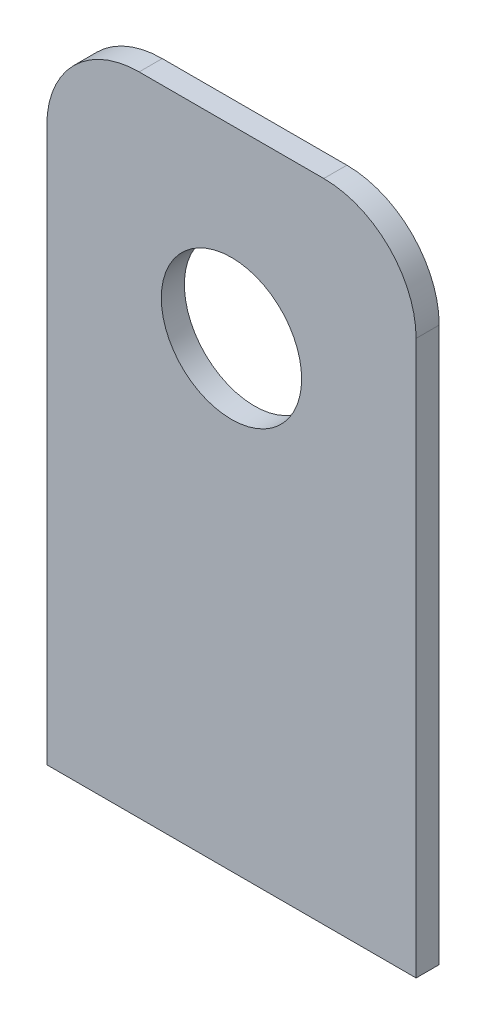
ISO-10303-21;
HEADER;
FILE_DESCRIPTION(('STEP AP214'),'2;1');
FILE_NAME('part.step','',(''),(''),'','','');
FILE_SCHEMA(('AUTOMOTIVE_DESIGN { 1 0 10303 214 1 1 1 1 }'));
ENDSEC;
DATA;
#1=APPLICATION_CONTEXT('core data for automotive mechanical design processes');
#2=APPLICATION_PROTOCOL_DEFINITION('international standard','automotive_design',2000,#1);
#3=PRODUCT_CONTEXT('',#1,'mechanical');
#4=PRODUCT('Part','Part','',(#3));
#5=PRODUCT_RELATED_PRODUCT_CATEGORY('part','',(#4));
#6=PRODUCT_DEFINITION_FORMATION('','',#4);
#7=PRODUCT_DEFINITION_CONTEXT('part definition',#1,'design');
#8=PRODUCT_DEFINITION('design','',#6,#7);
#9=PRODUCT_DEFINITION_SHAPE('','',#8);
#10=(LENGTH_UNIT() NAMED_UNIT(*) SI_UNIT(.MILLI.,.METRE.));
#11=(NAMED_UNIT(*) PLANE_ANGLE_UNIT() SI_UNIT($,.RADIAN.));
#12=(NAMED_UNIT(*) SI_UNIT($,.STERADIAN.) SOLID_ANGLE_UNIT());
#13=UNCERTAINTY_MEASURE_WITH_UNIT(LENGTH_MEASURE(1.E-05),#10,'distance_accuracy_value','');
#14=(GEOMETRIC_REPRESENTATION_CONTEXT(3) GLOBAL_UNCERTAINTY_ASSIGNED_CONTEXT((#13)) GLOBAL_UNIT_ASSIGNED_CONTEXT((#10,
#11,#12)) REPRESENTATION_CONTEXT('',''));
#15=CARTESIAN_POINT('',(0.,0.,0.));
#16=DIRECTION('',(0.,0.,1.));
#17=DIRECTION('',(1.,0.,0.));
#18=AXIS2_PLACEMENT_3D('',#15,#16,#17);
#19=CARTESIAN_POINT('',(-12.7,0.,1.5875));
#20=DIRECTION('',(1.,0.,0.));
#21=DIRECTION('',(0.,0.,-1.));
#22=AXIS2_PLACEMENT_3D('',#19,#20,#21);
#23=PLANE('',#22);
#24=DIRECTION('',(0.,-1.,0.));
#25=VECTOR('',#24,1.);
#26=CARTESIAN_POINT('',(-12.7,0.,1.5875));
#27=LINE('',#26,#25);
#28=CARTESIAN_POINT('',(-12.7,25.4,1.5875));
#29=VERTEX_POINT('',#28);
#30=CARTESIAN_POINT('',(-12.7,-12.7,1.58750000000001));
#31=VERTEX_POINT('',#30);
#32=EDGE_CURVE('E127',#29,#31,#27,.T.);
#33=ORIENTED_EDGE('',*,*,#32,.F.);
#34=DIRECTION('',(0.,0.,-1.));
#35=VECTOR('',#34,1.);
#36=CARTESIAN_POINT('',(-12.7,25.4,1.5875));
#37=LINE('',#36,#35);
#38=CARTESIAN_POINT('',(-12.7,25.4,0.));
#39=VERTEX_POINT('',#38);
#40=EDGE_CURVE('E11',#29,#39,#37,.T.);
#41=ORIENTED_EDGE('',*,*,#40,.T.);
#42=DIRECTION('',(0.,-1.,0.));
#43=VECTOR('',#42,1.);
#44=CARTESIAN_POINT('',(-12.7,0.,0.));
#45=LINE('',#44,#43);
#46=CARTESIAN_POINT('',(-12.7,-12.7,0.));
#47=VERTEX_POINT('',#46);
#48=EDGE_CURVE('E102',#39,#47,#45,.T.);
#49=ORIENTED_EDGE('',*,*,#48,.T.);
#50=DIRECTION('',(0.,0.,-1.));
#51=VECTOR('',#50,1.);
#52=CARTESIAN_POINT('',(-12.7,-12.7,29.9855633142473));
#53=LINE('',#52,#51);
#54=EDGE_CURVE('E111',#31,#47,#53,.T.);
#55=ORIENTED_EDGE('',*,*,#54,.F.);
#56=EDGE_LOOP('',(#33,#41,#49,#55));
#57=FACE_BOUND('',#56,.T.);
#58=ADVANCED_FACE('F39',(#57),#23,.F.);
#59=CARTESIAN_POINT('',(12.7,0.,1.5875));
#60=DIRECTION('',(-1.,0.,0.));
#61=DIRECTION('',(0.,0.,1.));
#62=AXIS2_PLACEMENT_3D('',#59,#60,#61);
#63=PLANE('',#62);
#64=DIRECTION('',(0.,1.,0.));
#65=VECTOR('',#64,1.);
#66=CARTESIAN_POINT('',(12.7,0.,0.));
#67=LINE('',#66,#65);
#68=CARTESIAN_POINT('',(12.7,-12.7,0.));
#69=VERTEX_POINT('',#68);
#70=CARTESIAN_POINT('',(12.7,25.4,0.));
#71=VERTEX_POINT('',#70);
#72=EDGE_CURVE('E93',#69,#71,#67,.T.);
#73=ORIENTED_EDGE('',*,*,#72,.T.);
#74=DIRECTION('',(0.,0.,-1.));
#75=VECTOR('',#74,1.);
#76=CARTESIAN_POINT('',(12.7,25.4,1.5875));
#77=LINE('',#76,#75);
#78=CARTESIAN_POINT('',(12.7,25.4,1.5875));
#79=VERTEX_POINT('',#78);
#80=EDGE_CURVE('E62',#71,#79,#77,.F.);
#81=ORIENTED_EDGE('',*,*,#80,.T.);
#82=DIRECTION('',(0.,1.,0.));
#83=VECTOR('',#82,1.);
#84=CARTESIAN_POINT('',(12.7,0.,1.5875));
#85=LINE('',#84,#83);
#86=CARTESIAN_POINT('',(12.7,-12.7,1.5875));
#87=VERTEX_POINT('',#86);
#88=EDGE_CURVE('E107',#87,#79,#85,.T.);
#89=ORIENTED_EDGE('',*,*,#88,.F.);
#90=DIRECTION('',(0.,0.,-1.));
#91=VECTOR('',#90,1.);
#92=CARTESIAN_POINT('',(12.7,-12.7,29.9855633142473));
#93=LINE('',#92,#91);
#94=EDGE_CURVE('E105',#87,#69,#93,.T.);
#95=ORIENTED_EDGE('',*,*,#94,.T.);
#96=EDGE_LOOP('',(#73,#81,#89,#95));
#97=FACE_BOUND('',#96,.T.);
#98=ADVANCED_FACE('F106',(#97),#63,.F.);
#99=CARTESIAN_POINT('',(-12.7,31.75,1.5875));
#100=DIRECTION('',(0.,-1.,0.));
#101=DIRECTION('',(0.,0.,-1.));
#102=AXIS2_PLACEMENT_3D('',#99,#100,#101);
#103=PLANE('',#102);
#104=DIRECTION('',(-1.,0.,0.));
#105=VECTOR('',#104,1.);
#106=CARTESIAN_POINT('',(-12.7,31.75,1.5875));
#107=LINE('',#106,#105);
#108=CARTESIAN_POINT('',(6.35,31.75,1.5875));
#109=VERTEX_POINT('',#108);
#110=CARTESIAN_POINT('',(-6.35,31.75,1.5875));
#111=VERTEX_POINT('',#110);
#112=EDGE_CURVE('E130',#109,#111,#107,.T.);
#113=ORIENTED_EDGE('',*,*,#112,.F.);
#114=DIRECTION('',(0.,0.,-1.));
#115=VECTOR('',#114,1.);
#116=CARTESIAN_POINT('',(6.35,31.75,1.5875));
#117=LINE('',#116,#115);
#118=CARTESIAN_POINT('',(6.35,31.75,0.));
#119=VERTEX_POINT('',#118);
#120=EDGE_CURVE('E137',#109,#119,#117,.T.);
#121=ORIENTED_EDGE('',*,*,#120,.T.);
#122=DIRECTION('',(-1.,0.,0.));
#123=VECTOR('',#122,1.);
#124=CARTESIAN_POINT('',(-12.7,31.75,0.));
#125=LINE('',#124,#123);
#126=CARTESIAN_POINT('',(-6.35,31.75,0.));
#127=VERTEX_POINT('',#126);
#128=EDGE_CURVE('E101',#119,#127,#125,.T.);
#129=ORIENTED_EDGE('',*,*,#128,.T.);
#130=DIRECTION('',(0.,0.,-1.));
#131=VECTOR('',#130,1.);
#132=CARTESIAN_POINT('',(-6.35,31.75,1.5875));
#133=LINE('',#132,#131);
#134=EDGE_CURVE('E132',#127,#111,#133,.F.);
#135=ORIENTED_EDGE('',*,*,#134,.T.);
#136=EDGE_LOOP('',(#113,#121,#129,#135));
#137=FACE_BOUND('',#136,.T.);
#138=ADVANCED_FACE('F150',(#137),#103,.F.);
#139=CARTESIAN_POINT('',(0.,0.,1.5875));
#140=DIRECTION('',(0.,0.,-1.));
#141=DIRECTION('',(-1.,0.,0.));
#142=AXIS2_PLACEMENT_3D('',#139,#140,#141);
#143=PLANE('',#142);
#144=CARTESIAN_POINT('',(0.,19.05,1.5875));
#145=DIRECTION('',(0.,0.,-1.));
#146=DIRECTION('',(-1.,0.,0.));
#147=AXIS2_PLACEMENT_3D('',#144,#145,#146);
#148=CIRCLE('',#147,4.826);
#149=CARTESIAN_POINT('',(-4.826,19.05,1.5875));
#150=VERTEX_POINT('',#149);
#151=EDGE_CURVE('E124',#150,#150,#148,.T.);
#152=ORIENTED_EDGE('',*,*,#151,.T.);
#153=EDGE_LOOP('',(#152));
#154=FACE_BOUND('',#153,.T.);
#155=ORIENTED_EDGE('',*,*,#88,.T.);
#156=CARTESIAN_POINT('',(6.35,25.4,1.5875));
#157=DIRECTION('',(0.,0.,-1.));
#158=DIRECTION('',(-1.,0.,0.));
#159=AXIS2_PLACEMENT_3D('',#156,#157,#158);
#160=CIRCLE('',#159,6.35);
#161=EDGE_CURVE('E47',#79,#109,#160,.F.);
#162=ORIENTED_EDGE('',*,*,#161,.T.);
#163=ORIENTED_EDGE('',*,*,#112,.T.);
#164=CARTESIAN_POINT('',(-6.35,25.4,1.5875));
#165=DIRECTION('',(0.,0.,-1.));
#166=DIRECTION('',(-1.,0.,0.));
#167=AXIS2_PLACEMENT_3D('',#164,#165,#166);
#168=CIRCLE('',#167,6.35);
#169=EDGE_CURVE('E54',#111,#29,#168,.F.);
#170=ORIENTED_EDGE('',*,*,#169,.T.);
#171=ORIENTED_EDGE('',*,*,#32,.T.);
#172=DIRECTION('',(1.,0.,0.));
#173=VECTOR('',#172,1.);
#174=CARTESIAN_POINT('',(12.7,-12.7,1.5875));
#175=LINE('',#174,#173);
#176=EDGE_CURVE('E118',#31,#87,#175,.T.);
#177=ORIENTED_EDGE('',*,*,#176,.T.);
#178=EDGE_LOOP('',(#155,#162,#163,#170,#171,#177));
#179=FACE_BOUND('',#178,.T.);
#180=ADVANCED_FACE('F146',(#154,#179),#143,.F.);
#181=CARTESIAN_POINT('',(0.,0.,0.));
#182=DIRECTION('',(0.,0.,-1.));
#183=DIRECTION('',(-1.,0.,0.));
#184=AXIS2_PLACEMENT_3D('',#181,#182,#183);
#185=PLANE('',#184);
#186=CARTESIAN_POINT('',(0.,19.05,0.));
#187=DIRECTION('',(0.,0.,1.));
#188=DIRECTION('',(1.,0.,0.));
#189=AXIS2_PLACEMENT_3D('',#186,#187,#188);
#190=CIRCLE('',#189,4.826);
#191=CARTESIAN_POINT('',(4.826,19.05,0.));
#192=VERTEX_POINT('',#191);
#193=EDGE_CURVE('E121',#192,#192,#190,.T.);
#194=ORIENTED_EDGE('',*,*,#193,.T.);
#195=EDGE_LOOP('',(#194));
#196=FACE_BOUND('',#195,.T.);
#197=ORIENTED_EDGE('',*,*,#128,.F.);
#198=CARTESIAN_POINT('',(6.35,25.4,0.));
#199=DIRECTION('',(0.,0.,-1.));
#200=DIRECTION('',(-1.,0.,0.));
#201=AXIS2_PLACEMENT_3D('',#198,#199,#200);
#202=CIRCLE('',#201,6.35);
#203=EDGE_CURVE('E100',#119,#71,#202,.T.);
#204=ORIENTED_EDGE('',*,*,#203,.T.);
#205=ORIENTED_EDGE('',*,*,#72,.F.);
#206=DIRECTION('',(-1.,0.,0.));
#207=VECTOR('',#206,1.);
#208=CARTESIAN_POINT('',(12.7,-12.7,0.));
#209=LINE('',#208,#207);
#210=EDGE_CURVE('E99',#69,#47,#209,.T.);
#211=ORIENTED_EDGE('',*,*,#210,.T.);
#212=ORIENTED_EDGE('',*,*,#48,.F.);
#213=CARTESIAN_POINT('',(-6.35,25.4,0.));
#214=DIRECTION('',(0.,0.,-1.));
#215=DIRECTION('',(-1.,0.,0.));
#216=AXIS2_PLACEMENT_3D('',#213,#214,#215);
#217=CIRCLE('',#216,6.35);
#218=EDGE_CURVE('E140',#39,#127,#217,.T.);
#219=ORIENTED_EDGE('',*,*,#218,.T.);
#220=EDGE_LOOP('',(#197,#204,#205,#211,#212,#219));
#221=FACE_BOUND('',#220,.T.);
#222=ADVANCED_FACE('F96',(#196,#221),#185,.T.);
#223=CARTESIAN_POINT('',(0.,19.05,0.));
#224=DIRECTION('',(0.,0.,1.));
#225=DIRECTION('',(1.,0.,0.));
#226=AXIS2_PLACEMENT_3D('',#223,#224,#225);
#227=CYLINDRICAL_SURFACE('',#226,4.826);
#228=ORIENTED_EDGE('',*,*,#193,.F.);
#229=EDGE_LOOP('',(#228));
#230=FACE_BOUND('',#229,.T.);
#231=ORIENTED_EDGE('',*,*,#151,.F.);
#232=EDGE_LOOP('',(#231));
#233=FACE_BOUND('',#232,.T.);
#234=ADVANCED_FACE('F154',(#230,#233),#227,.F.);
#235=CARTESIAN_POINT('',(6.35,25.4,1.5875));
#236=DIRECTION('',(0.,0.,-1.));
#237=DIRECTION('',(-1.,0.,0.));
#238=AXIS2_PLACEMENT_3D('',#235,#236,#237);
#239=CYLINDRICAL_SURFACE('',#238,6.35);
#240=ORIENTED_EDGE('',*,*,#161,.F.);
#241=ORIENTED_EDGE('',*,*,#80,.F.);
#242=ORIENTED_EDGE('',*,*,#203,.F.);
#243=ORIENTED_EDGE('',*,*,#120,.F.);
#244=EDGE_LOOP('',(#240,#241,#242,#243));
#245=FACE_BOUND('',#244,.T.);
#246=ADVANCED_FACE('F152',(#245),#239,.T.);
#247=CARTESIAN_POINT('',(-6.35,25.4,1.5875));
#248=DIRECTION('',(0.,0.,-1.));
#249=DIRECTION('',(-1.,0.,0.));
#250=AXIS2_PLACEMENT_3D('',#247,#248,#249);
#251=CYLINDRICAL_SURFACE('',#250,6.35);
#252=ORIENTED_EDGE('',*,*,#169,.F.);
#253=ORIENTED_EDGE('',*,*,#134,.F.);
#254=ORIENTED_EDGE('',*,*,#218,.F.);
#255=ORIENTED_EDGE('',*,*,#40,.F.);
#256=EDGE_LOOP('',(#252,#253,#254,#255));
#257=FACE_BOUND('',#256,.T.);
#258=ADVANCED_FACE('F41',(#257),#251,.T.);
#259=CARTESIAN_POINT('',(12.7,-12.7,29.9855633142473));
#260=DIRECTION('',(0.,-1.,0.));
#261=DIRECTION('',(0.,0.,-1.));
#262=AXIS2_PLACEMENT_3D('',#259,#260,#261);
#263=PLANE('',#262);
#264=ORIENTED_EDGE('',*,*,#176,.F.);
#265=ORIENTED_EDGE('',*,*,#54,.T.);
#266=ORIENTED_EDGE('',*,*,#210,.F.);
#267=ORIENTED_EDGE('',*,*,#94,.F.);
#268=EDGE_LOOP('',(#264,#265,#266,#267));
#269=FACE_BOUND('',#268,.T.);
#270=ADVANCED_FACE('F114',(#269),#263,.T.);
#271=CLOSED_SHELL('',(#58,#98,#138,#180,#222,#234,#246,#258,#270));
#272=MANIFOLD_SOLID_BREP('B2',#271);
#273=ADVANCED_BREP_SHAPE_REPRESENTATION('',(#18,#272),#14);
#274=SHAPE_DEFINITION_REPRESENTATION(#9,#273);
ENDSEC;
END-ISO-10303-21;
